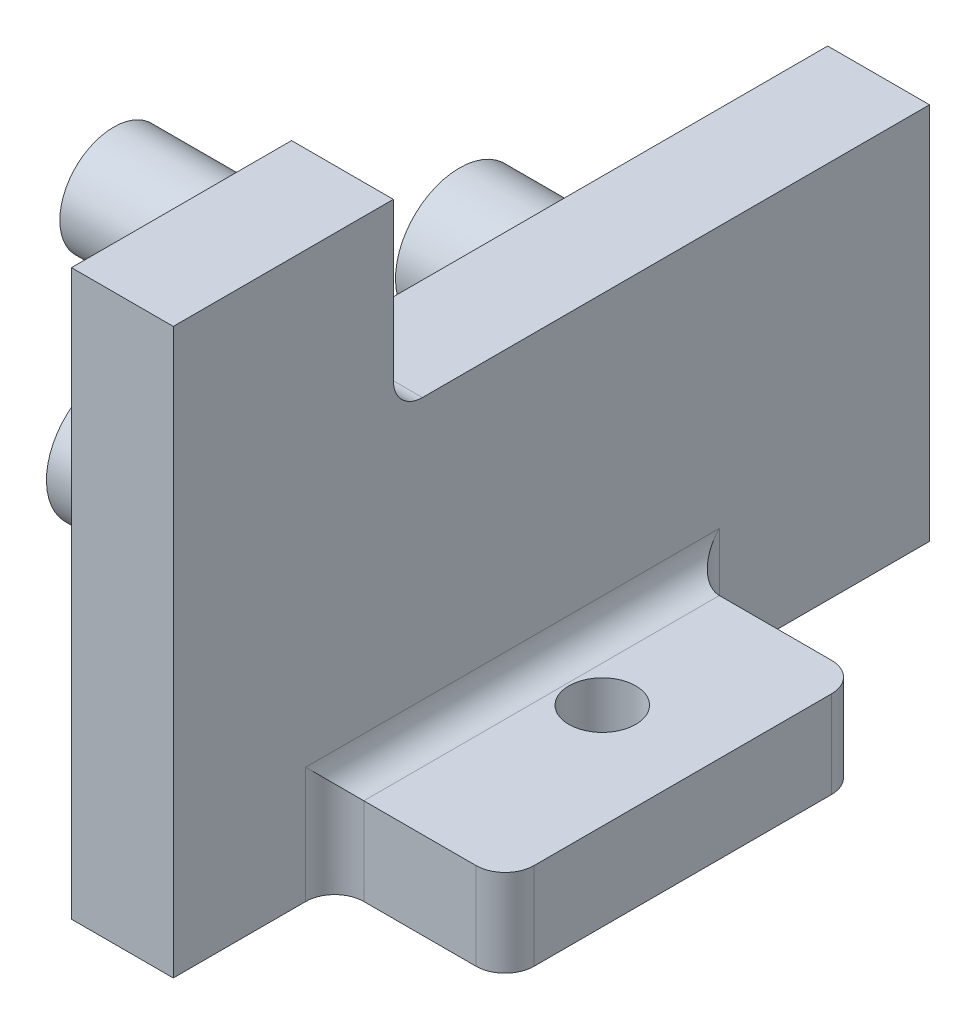
ISO-10303-21;
HEADER;
FILE_DESCRIPTION(('STEP AP214'),'2;1');
FILE_NAME('part.step','',(''),(''),'','','');
FILE_SCHEMA(('AUTOMOTIVE_DESIGN { 1 0 10303 214 1 1 1 1 }'));
ENDSEC;
DATA;
#1=APPLICATION_CONTEXT('core data for automotive mechanical design processes');
#2=APPLICATION_PROTOCOL_DEFINITION('international standard','automotive_design',2000,#1);
#3=PRODUCT_CONTEXT('',#1,'mechanical');
#4=PRODUCT('Part','Part','',(#3));
#5=PRODUCT_RELATED_PRODUCT_CATEGORY('part','',(#4));
#6=PRODUCT_DEFINITION_FORMATION('','',#4);
#7=PRODUCT_DEFINITION_CONTEXT('part definition',#1,'design');
#8=PRODUCT_DEFINITION('design','',#6,#7);
#9=PRODUCT_DEFINITION_SHAPE('','',#8);
#10=(LENGTH_UNIT() NAMED_UNIT(*) SI_UNIT(.MILLI.,.METRE.));
#11=(NAMED_UNIT(*) PLANE_ANGLE_UNIT() SI_UNIT($,.RADIAN.));
#12=(NAMED_UNIT(*) SI_UNIT($,.STERADIAN.) SOLID_ANGLE_UNIT());
#13=UNCERTAINTY_MEASURE_WITH_UNIT(LENGTH_MEASURE(1.E-05),#10,'distance_accuracy_value','');
#14=(GEOMETRIC_REPRESENTATION_CONTEXT(3) GLOBAL_UNCERTAINTY_ASSIGNED_CONTEXT((#13)) GLOBAL_UNIT_ASSIGNED_CONTEXT((#10,
#11,#12)) REPRESENTATION_CONTEXT('',''));
#15=CARTESIAN_POINT('',(0.,0.,0.));
#16=DIRECTION('',(0.,0.,1.));
#17=DIRECTION('',(1.,0.,0.));
#18=AXIS2_PLACEMENT_3D('',#15,#16,#17);
#19=CARTESIAN_POINT('',(7.22580761951249,-2.588131767118,19.447472496282));
#20=DIRECTION('',(0.,1.,0.));
#21=DIRECTION('',(0.,0.,1.));
#22=AXIS2_PLACEMENT_3D('',#19,#20,#21);
#23=CYLINDRICAL_SURFACE('',#22,1.);
#24=DIRECTION('',(0.,1.,0.));
#25=VECTOR('',#24,1.);
#26=CARTESIAN_POINT('',(7.22580761951249,-2.588131767118,20.447472496282));
#27=LINE('',#26,#25);
#28=CARTESIAN_POINT('',(7.22580761951249,-5.588131767118,20.447472496282));
#29=VERTEX_POINT('',#28);
#30=CARTESIAN_POINT('',(7.22580761951249,-2.588131767118,20.447472496282));
#31=VERTEX_POINT('',#30);
#32=EDGE_CURVE('E293',#29,#31,#27,.T.);
#33=ORIENTED_EDGE('',*,*,#32,.F.);
#34=CARTESIAN_POINT('',(7.22580761951249,-5.588131767118,19.447472496282));
#35=DIRECTION('',(0.,1.,0.));
#36=DIRECTION('',(0.,0.,1.));
#37=AXIS2_PLACEMENT_3D('',#34,#35,#36);
#38=CIRCLE('',#37,1.);
#39=CARTESIAN_POINT('',(8.22580761951249,-5.588131767118,19.447472496282));
#40=VERTEX_POINT('',#39);
#41=EDGE_CURVE('E299',#40,#29,#38,.F.);
#42=ORIENTED_EDGE('',*,*,#41,.F.);
#43=DIRECTION('',(0.,1.,0.));
#44=VECTOR('',#43,1.);
#45=CARTESIAN_POINT('',(8.22580761951249,-2.588131767118,19.447472496282));
#46=LINE('',#45,#44);
#47=CARTESIAN_POINT('',(8.22580761951249,-2.588131767118,19.447472496282));
#48=VERTEX_POINT('',#47);
#49=EDGE_CURVE('E296',#48,#40,#46,.F.);
#50=ORIENTED_EDGE('',*,*,#49,.F.);
#51=CARTESIAN_POINT('',(7.22580761951249,-2.588131767118,19.447472496282));
#52=DIRECTION('',(0.,-1.,0.));
#53=DIRECTION('',(0.,0.,-1.));
#54=AXIS2_PLACEMENT_3D('',#51,#52,#53);
#55=CIRCLE('',#54,1.);
#56=EDGE_CURVE('E301',#31,#48,#55,.F.);
#57=ORIENTED_EDGE('',*,*,#56,.F.);
#58=EDGE_LOOP('',(#33,#42,#50,#57));
#59=FACE_BOUND('',#58,.T.);
#60=ADVANCED_FACE('F42',(#59),#23,.T.);
#61=CARTESIAN_POINT('',(7.22580761951249,-2.588131767118,9.22469685295635));
#62=DIRECTION('',(0.,-1.,0.));
#63=DIRECTION('',(0.,0.,-1.));
#64=AXIS2_PLACEMENT_3D('',#61,#62,#63);
#65=CYLINDRICAL_SURFACE('',#64,1.);
#66=DIRECTION('',(0.,-1.,0.));
#67=VECTOR('',#66,1.);
#68=CARTESIAN_POINT('',(7.22580761951249,-2.588131767118,8.22469685295635));
#69=LINE('',#68,#67);
#70=CARTESIAN_POINT('',(7.22580761951249,-2.588131767118,8.22469685295635));
#71=VERTEX_POINT('',#70);
#72=CARTESIAN_POINT('',(7.22580761951249,-5.588131767118,8.22469685295635));
#73=VERTEX_POINT('',#72);
#74=EDGE_CURVE('E283',#71,#73,#69,.T.);
#75=ORIENTED_EDGE('',*,*,#74,.F.);
#76=CARTESIAN_POINT('',(7.22580761951249,-2.588131767118,9.22469685295635));
#77=DIRECTION('',(0.,-1.,0.));
#78=DIRECTION('',(0.,0.,-1.));
#79=AXIS2_PLACEMENT_3D('',#76,#77,#78);
#80=CIRCLE('',#79,1.);
#81=CARTESIAN_POINT('',(8.22580761951249,-2.588131767118,9.22469685295635));
#82=VERTEX_POINT('',#81);
#83=EDGE_CURVE('E289',#82,#71,#80,.F.);
#84=ORIENTED_EDGE('',*,*,#83,.F.);
#85=DIRECTION('',(0.,-1.,0.));
#86=VECTOR('',#85,1.);
#87=CARTESIAN_POINT('',(8.22580761951249,-2.588131767118,9.22469685295635));
#88=LINE('',#87,#86);
#89=CARTESIAN_POINT('',(8.22580761951249,-5.588131767118,9.22469685295635));
#90=VERTEX_POINT('',#89);
#91=EDGE_CURVE('E286',#90,#82,#88,.F.);
#92=ORIENTED_EDGE('',*,*,#91,.F.);
#93=CARTESIAN_POINT('',(7.22580761951249,-5.588131767118,9.22469685295635));
#94=DIRECTION('',(0.,1.,0.));
#95=DIRECTION('',(0.,0.,1.));
#96=AXIS2_PLACEMENT_3D('',#93,#94,#95);
#97=CIRCLE('',#96,1.);
#98=EDGE_CURVE('E291',#73,#90,#97,.F.);
#99=ORIENTED_EDGE('',*,*,#98,.F.);
#100=EDGE_LOOP('',(#75,#84,#92,#99));
#101=FACE_BOUND('',#100,.T.);
#102=ADVANCED_FACE('F352',(#101),#65,.T.);
#103=CARTESIAN_POINT('',(3.37133550488599,-2.588131767118,7.22469685295635));
#104=DIRECTION('',(0.,-1.,0.));
#105=DIRECTION('',(0.,0.,-1.));
#106=AXIS2_PLACEMENT_3D('',#103,#104,#105);
#107=CYLINDRICAL_SURFACE('',#106,1.);
#108=DIRECTION('',(0.,1.,0.));
#109=VECTOR('',#108,1.);
#110=CARTESIAN_POINT('',(3.37133550488599,-2.588131767118,8.22469685295635));
#111=LINE('',#110,#109);
#112=CARTESIAN_POINT('',(3.37133550488599,-5.588131767118,8.22469685295635));
#113=VERTEX_POINT('',#112);
#114=CARTESIAN_POINT('',(3.37133550488599,-2.588131767118,8.22469685295635));
#115=VERTEX_POINT('',#114);
#116=EDGE_CURVE('E273',#113,#115,#111,.T.);
#117=ORIENTED_EDGE('',*,*,#116,.F.);
#118=CARTESIAN_POINT('',(3.37133550488599,-5.588131767118,7.22469685295635));
#119=DIRECTION('',(0.,1.,0.));
#120=DIRECTION('',(0.,0.,1.));
#121=AXIS2_PLACEMENT_3D('',#118,#119,#120);
#122=CIRCLE('',#121,1.);
#123=CARTESIAN_POINT('',(2.37133550488599,-5.588131767118,7.22469685295635));
#124=VERTEX_POINT('',#123);
#125=EDGE_CURVE('E279',#113,#124,#122,.F.);
#126=ORIENTED_EDGE('',*,*,#125,.T.);
#127=DIRECTION('',(0.,1.,0.));
#128=VECTOR('',#127,1.);
#129=CARTESIAN_POINT('',(2.37133550488599,-2.588131767118,7.22469685295635));
#130=LINE('',#129,#128);
#131=CARTESIAN_POINT('',(2.37133550488599,-1.588131767118,7.22469685295635));
#132=VERTEX_POINT('',#131);
#133=EDGE_CURVE('E276',#132,#124,#130,.F.);
#134=ORIENTED_EDGE('',*,*,#133,.F.);
#135=CARTESIAN_POINT('',(3.37133550488599,-1.588131767118,7.22469685295635));
#136=DIRECTION('',(0.,-0.707106781186547,-0.707106781186547));
#137=DIRECTION('',(0.,0.707106781186547,-0.707106781186547));
#138=AXIS2_PLACEMENT_3D('',#135,#136,#137);
#139=ELLIPSE('',#138,1.41421356237309,1.);
#140=EDGE_CURVE('E281',#132,#115,#139,.F.);
#141=ORIENTED_EDGE('',*,*,#140,.T.);
#142=EDGE_LOOP('',(#117,#126,#134,#141));
#143=FACE_BOUND('',#142,.T.);
#144=ADVANCED_FACE('F357',(#143),#107,.F.);
#145=CARTESIAN_POINT('',(3.37133550488599,7.411868232882,21.447472496282));
#146=DIRECTION('',(0.,-1.,0.));
#147=DIRECTION('',(0.,0.,-1.));
#148=AXIS2_PLACEMENT_3D('',#145,#146,#147);
#149=CYLINDRICAL_SURFACE('',#148,1.);
#150=DIRECTION('',(0.,1.,0.));
#151=VECTOR('',#150,1.);
#152=CARTESIAN_POINT('',(2.37133550488599,7.411868232882,21.447472496282));
#153=LINE('',#152,#151);
#154=CARTESIAN_POINT('',(2.37133550488599,-5.588131767118,21.447472496282));
#155=VERTEX_POINT('',#154);
#156=CARTESIAN_POINT('',(2.37133550488599,-1.588131767118,21.447472496282));
#157=VERTEX_POINT('',#156);
#158=EDGE_CURVE('E261',#155,#157,#153,.T.);
#159=ORIENTED_EDGE('',*,*,#158,.F.);
#160=CARTESIAN_POINT('',(3.37133550488599,-5.588131767118,21.447472496282));
#161=DIRECTION('',(0.,1.,0.));
#162=DIRECTION('',(0.,0.,1.));
#163=AXIS2_PLACEMENT_3D('',#160,#161,#162);
#164=CIRCLE('',#163,1.);
#165=CARTESIAN_POINT('',(3.37133550488599,-5.588131767118,20.447472496282));
#166=VERTEX_POINT('',#165);
#167=EDGE_CURVE('E267',#155,#166,#164,.F.);
#168=ORIENTED_EDGE('',*,*,#167,.T.);
#169=DIRECTION('',(0.,1.,0.));
#170=VECTOR('',#169,1.);
#171=CARTESIAN_POINT('',(3.37133550488599,7.411868232882,20.447472496282));
#172=LINE('',#171,#170);
#173=CARTESIAN_POINT('',(3.37133550488599,-2.588131767118,20.447472496282));
#174=VERTEX_POINT('',#173);
#175=EDGE_CURVE('E264',#174,#166,#172,.F.);
#176=ORIENTED_EDGE('',*,*,#175,.F.);
#177=CARTESIAN_POINT('',(3.37133550488599,-1.588131767118,21.447472496282));
#178=DIRECTION('',(0.,0.707106781186547,-0.707106781186547));
#179=DIRECTION('',(0.,-0.707106781186547,-0.707106781186547));
#180=AXIS2_PLACEMENT_3D('',#177,#178,#179);
#181=ELLIPSE('',#180,1.41421356237309,1.);
#182=EDGE_CURVE('E270',#174,#157,#181,.T.);
#183=ORIENTED_EDGE('',*,*,#182,.T.);
#184=EDGE_LOOP('',(#159,#168,#176,#183));
#185=FACE_BOUND('',#184,.T.);
#186=ADVANCED_FACE('F364',(#185),#149,.F.);
#187=CARTESIAN_POINT('',(3.37133550488599,-1.588131767118,26.));
#188=DIRECTION('',(0.,0.,-1.));
#189=DIRECTION('',(-1.,0.,0.));
#190=AXIS2_PLACEMENT_3D('',#187,#188,#189);
#191=CYLINDRICAL_SURFACE('',#190,1.);
#192=DIRECTION('',(0.,0.,-1.));
#193=VECTOR('',#192,1.);
#194=CARTESIAN_POINT('',(2.37133550488599,-1.588131767118,26.));
#195=LINE('',#194,#193);
#196=EDGE_CURVE('E254',#157,#132,#195,.T.);
#197=ORIENTED_EDGE('',*,*,#196,.F.);
#198=ORIENTED_EDGE('',*,*,#182,.F.);
#199=DIRECTION('',(0.,0.,-1.));
#200=VECTOR('',#199,1.);
#201=CARTESIAN_POINT('',(3.37133550488599,-2.588131767118,0.));
#202=LINE('',#201,#200);
#203=EDGE_CURVE('E258',#115,#174,#202,.F.);
#204=ORIENTED_EDGE('',*,*,#203,.F.);
#205=ORIENTED_EDGE('',*,*,#140,.F.);
#206=EDGE_LOOP('',(#197,#198,#204,#205));
#207=FACE_BOUND('',#206,.T.);
#208=ADVANCED_FACE('F368',(#207),#191,.F.);
#209=CARTESIAN_POINT('',(-1.12866449511401,7.411868232882,26.));
#210=DIRECTION('',(0.,1.,0.));
#211=DIRECTION('',(0.,0.,1.));
#212=AXIS2_PLACEMENT_3D('',#209,#210,#211);
#213=PLANE('',#212);
#214=DIRECTION('',(0.,0.,-1.));
#215=VECTOR('',#214,1.);
#216=CARTESIAN_POINT('',(-1.12866449511401,7.411868232882,26.));
#217=LINE('',#216,#215);
#218=CARTESIAN_POINT('',(-1.12866449511401,7.411868232882,17.4336633371393));
#219=VERTEX_POINT('',#218);
#220=CARTESIAN_POINT('',(-1.12866449511401,7.411868232882,0.));
#221=VERTEX_POINT('',#220);
#222=EDGE_CURVE('E238',#219,#221,#217,.T.);
#223=ORIENTED_EDGE('',*,*,#222,.F.);
#224=DIRECTION('',(-1.,0.,0.));
#225=VECTOR('',#224,1.);
#226=CARTESIAN_POINT('',(2.37133550488599,7.411868232882,17.4336633371393));
#227=LINE('',#226,#225);
#228=CARTESIAN_POINT('',(2.37133550488599,7.411868232882,17.4336633371393));
#229=VERTEX_POINT('',#228);
#230=EDGE_CURVE('E63',#219,#229,#227,.F.);
#231=ORIENTED_EDGE('',*,*,#230,.T.);
#232=DIRECTION('',(0.,0.,-1.));
#233=VECTOR('',#232,1.);
#234=CARTESIAN_POINT('',(2.37133550488599,7.411868232882,26.));
#235=LINE('',#234,#233);
#236=CARTESIAN_POINT('',(2.37133550488599,7.411868232882,0.));
#237=VERTEX_POINT('',#236);
#238=EDGE_CURVE('E228',#229,#237,#235,.T.);
#239=ORIENTED_EDGE('',*,*,#238,.T.);
#240=DIRECTION('',(1.,0.,0.));
#241=VECTOR('',#240,1.);
#242=CARTESIAN_POINT('',(-1.12866449511401,7.411868232882,0.));
#243=LINE('',#242,#241);
#244=EDGE_CURVE('E220',#221,#237,#243,.T.);
#245=ORIENTED_EDGE('',*,*,#244,.F.);
#246=EDGE_LOOP('',(#223,#231,#239,#245));
#247=FACE_BOUND('',#246,.T.);
#248=ADVANCED_FACE('F327',(#247),#213,.T.);
#249=CARTESIAN_POINT('',(-1.12866449511401,7.411868232882,26.));
#250=DIRECTION('',(1.,0.,0.));
#251=DIRECTION('',(0.,1.,0.));
#252=AXIS2_PLACEMENT_3D('',#249,#250,#251);
#253=PLANE('',#252);
#254=CARTESIAN_POINT('',(-1.12866449511401,11.7228939153549,20.85));
#255=DIRECTION('',(1.,0.,0.));
#256=DIRECTION('',(0.,1.,0.));
#257=AXIS2_PLACEMENT_3D('',#254,#255,#256);
#258=CIRCLE('',#257,1.85);
#259=CARTESIAN_POINT('',(-1.12866449511401,13.5728939153549,20.85));
#260=VERTEX_POINT('',#259);
#261=EDGE_CURVE('E303',#260,#260,#258,.F.);
#262=ORIENTED_EDGE('',*,*,#261,.F.);
#263=EDGE_LOOP('',(#262));
#264=FACE_BOUND('',#263,.T.);
#265=CARTESIAN_POINT('',(-1.12866449511401,1.41186823288201,18.16));
#266=DIRECTION('',(1.,0.,0.));
#267=DIRECTION('',(0.,1.,0.));
#268=AXIS2_PLACEMENT_3D('',#265,#266,#267);
#269=CIRCLE('',#268,2.2);
#270=CARTESIAN_POINT('',(-1.12866449511401,3.61186823288201,18.16));
#271=VERTEX_POINT('',#270);
#272=EDGE_CURVE('E251',#271,#271,#269,.F.);
#273=ORIENTED_EDGE('',*,*,#272,.F.);
#274=EDGE_LOOP('',(#273));
#275=FACE_BOUND('',#274,.T.);
#276=CARTESIAN_POINT('',(-1.12866449511401,1.411868232882,6.16));
#277=DIRECTION('',(1.,0.,0.));
#278=DIRECTION('',(0.,1.,0.));
#279=AXIS2_PLACEMENT_3D('',#276,#277,#278);
#280=CIRCLE('',#279,2.2);
#281=CARTESIAN_POINT('',(-1.12866449511401,3.611868232882,6.16));
#282=VERTEX_POINT('',#281);
#283=EDGE_CURVE('E240',#282,#282,#280,.F.);
#284=ORIENTED_EDGE('',*,*,#283,.F.);
#285=EDGE_LOOP('',(#284));
#286=FACE_BOUND('',#285,.T.);
#287=DIRECTION('',(0.,-1.,0.));
#288=VECTOR('',#287,1.);
#289=CARTESIAN_POINT('',(-1.12866449511401,7.411868232882,0.));
#290=LINE('',#289,#288);
#291=CARTESIAN_POINT('',(-1.12866449511401,-5.588131767118,0.));
#292=VERTEX_POINT('',#291);
#293=EDGE_CURVE('E224',#221,#292,#290,.T.);
#294=ORIENTED_EDGE('',*,*,#293,.T.);
#295=DIRECTION('',(0.,0.,-1.));
#296=VECTOR('',#295,1.);
#297=CARTESIAN_POINT('',(-1.12866449511401,-5.588131767118,26.));
#298=LINE('',#297,#296);
#299=CARTESIAN_POINT('',(-1.12866449511401,-5.588131767118,26.));
#300=VERTEX_POINT('',#299);
#301=EDGE_CURVE('E241',#300,#292,#298,.T.);
#302=ORIENTED_EDGE('',*,*,#301,.F.);
#303=DIRECTION('',(0.,-1.,0.));
#304=VECTOR('',#303,1.);
#305=CARTESIAN_POINT('',(-1.12866449511401,7.411868232882,26.));
#306=LINE('',#305,#304);
#307=CARTESIAN_POINT('',(-1.12866449511401,13.8128939153549,26.));
#308=VERTEX_POINT('',#307);
#309=EDGE_CURVE('E226',#308,#300,#306,.T.);
#310=ORIENTED_EDGE('',*,*,#309,.F.);
#311=DIRECTION('',(0.,0.,-1.));
#312=VECTOR('',#311,1.);
#313=CARTESIAN_POINT('',(-1.12866449511401,13.8128939153549,26.));
#314=LINE('',#313,#312);
#315=CARTESIAN_POINT('',(-1.12866449511401,13.8128939153549,18.4336633371393));
#316=VERTEX_POINT('',#315);
#317=EDGE_CURVE('E177',#308,#316,#314,.T.);
#318=ORIENTED_EDGE('',*,*,#317,.T.);
#319=DIRECTION('',(0.,-1.,0.));
#320=VECTOR('',#319,1.);
#321=CARTESIAN_POINT('',(-1.12866449511401,7.411868232882,18.4336633371393));
#322=LINE('',#321,#320);
#323=CARTESIAN_POINT('',(-1.12866449511401,8.411868232882,18.4336633371393));
#324=VERTEX_POINT('',#323);
#325=EDGE_CURVE('E169',#316,#324,#322,.T.);
#326=ORIENTED_EDGE('',*,*,#325,.T.);
#327=CARTESIAN_POINT('',(-1.12866449511401,8.411868232882,17.4336633371393));
#328=DIRECTION('',(1.,0.,0.));
#329=DIRECTION('',(0.,1.,0.));
#330=AXIS2_PLACEMENT_3D('',#327,#328,#329);
#331=CIRCLE('',#330,1.);
#332=EDGE_CURVE('E50',#324,#219,#331,.T.);
#333=ORIENTED_EDGE('',*,*,#332,.T.);
#334=ORIENTED_EDGE('',*,*,#222,.T.);
#335=EDGE_LOOP('',(#294,#302,#310,#318,#326,#333,#334));
#336=FACE_BOUND('',#335,.T.);
#337=ADVANCED_FACE('F309',(#264,#275,#286,#336),#253,.F.);
#338=CARTESIAN_POINT('',(-1.12866449511401,-5.588131767118,26.));
#339=DIRECTION('',(0.,1.,0.));
#340=DIRECTION('',(0.,0.,1.));
#341=AXIS2_PLACEMENT_3D('',#338,#339,#340);
#342=PLANE('',#341);
#343=DIRECTION('',(0.,0.,1.));
#344=VECTOR('',#343,1.);
#345=CARTESIAN_POINT('',(8.22580761951249,-5.588131767118,20.447472496282));
#346=LINE('',#345,#344);
#347=EDGE_CURVE('E199',#90,#40,#346,.T.);
#348=ORIENTED_EDGE('',*,*,#347,.T.);
#349=ORIENTED_EDGE('',*,*,#41,.T.);
#350=DIRECTION('',(-1.,0.,0.));
#351=VECTOR('',#350,1.);
#352=CARTESIAN_POINT('',(2.37133550488599,-5.588131767118,20.447472496282));
#353=LINE('',#352,#351);
#354=EDGE_CURVE('E190',#29,#166,#353,.T.);
#355=ORIENTED_EDGE('',*,*,#354,.T.);
#356=ORIENTED_EDGE('',*,*,#167,.F.);
#357=DIRECTION('',(0.,0.,-1.));
#358=VECTOR('',#357,1.);
#359=CARTESIAN_POINT('',(2.37133550488599,-5.588131767118,26.));
#360=LINE('',#359,#358);
#361=CARTESIAN_POINT('',(2.37133550488599,-5.588131767118,26.));
#362=VERTEX_POINT('',#361);
#363=EDGE_CURVE('E244',#362,#155,#360,.T.);
#364=ORIENTED_EDGE('',*,*,#363,.F.);
#365=DIRECTION('',(1.,0.,0.));
#366=VECTOR('',#365,1.);
#367=CARTESIAN_POINT('',(-1.12866449511401,-5.588131767118,26.));
#368=LINE('',#367,#366);
#369=EDGE_CURVE('E223',#300,#362,#368,.T.);
#370=ORIENTED_EDGE('',*,*,#369,.F.);
#371=ORIENTED_EDGE('',*,*,#301,.T.);
#372=DIRECTION('',(1.,0.,0.));
#373=VECTOR('',#372,1.);
#374=CARTESIAN_POINT('',(-1.12866449511401,-5.588131767118,0.));
#375=LINE('',#374,#373);
#376=CARTESIAN_POINT('',(2.37133550488599,-5.588131767118,0.));
#377=VERTEX_POINT('',#376);
#378=EDGE_CURVE('E234',#292,#377,#375,.T.);
#379=ORIENTED_EDGE('',*,*,#378,.T.);
#380=EDGE_CURVE('E247',#124,#377,#360,.T.);
#381=ORIENTED_EDGE('',*,*,#380,.F.);
#382=ORIENTED_EDGE('',*,*,#125,.F.);
#383=DIRECTION('',(1.,0.,0.));
#384=VECTOR('',#383,1.);
#385=CARTESIAN_POINT('',(2.37133550488599,-5.588131767118,8.22469685295635));
#386=LINE('',#385,#384);
#387=EDGE_CURVE('E196',#113,#73,#386,.T.);
#388=ORIENTED_EDGE('',*,*,#387,.T.);
#389=ORIENTED_EDGE('',*,*,#98,.T.);
#390=EDGE_LOOP('',(#348,#349,#355,#356,#364,#370,#371,#379,#381,#382,#388,#389));
#391=FACE_BOUND('',#390,.T.);
#392=CARTESIAN_POINT('',(4.62133550488599,-5.588131767118,13.5));
#393=DIRECTION('',(0.,-1.,0.));
#394=DIRECTION('',(0.,0.,-1.));
#395=AXIS2_PLACEMENT_3D('',#392,#393,#394);
#396=CIRCLE('',#395,1.15);
#397=CARTESIAN_POINT('',(4.62133550488599,-5.588131767118,12.35));
#398=VERTEX_POINT('',#397);
#399=EDGE_CURVE('E182',#398,#398,#396,.T.);
#400=ORIENTED_EDGE('',*,*,#399,.F.);
#401=EDGE_LOOP('',(#400));
#402=FACE_BOUND('',#401,.T.);
#403=CARTESIAN_POINT('',(0.621335504885992,-5.588131767118,18.));
#404=DIRECTION('',(0.,-1.,0.));
#405=DIRECTION('',(0.,0.,-1.));
#406=AXIS2_PLACEMENT_3D('',#403,#404,#405);
#407=CIRCLE('',#406,0.799999999999999);
#408=CARTESIAN_POINT('',(0.621335504885992,-5.588131767118,17.2));
#409=VERTEX_POINT('',#408);
#410=EDGE_CURVE('E195',#409,#409,#407,.T.);
#411=ORIENTED_EDGE('',*,*,#410,.F.);
#412=EDGE_LOOP('',(#411));
#413=FACE_BOUND('',#412,.T.);
#414=CARTESIAN_POINT('',(0.621335504885992,-5.588131767118,9.));
#415=DIRECTION('',(0.,-1.,0.));
#416=DIRECTION('',(0.,0.,-1.));
#417=AXIS2_PLACEMENT_3D('',#414,#415,#416);
#418=CIRCLE('',#417,0.799999999999999);
#419=CARTESIAN_POINT('',(0.621335504885992,-5.588131767118,8.2));
#420=VERTEX_POINT('',#419);
#421=EDGE_CURVE('E208',#420,#420,#418,.T.);
#422=ORIENTED_EDGE('',*,*,#421,.F.);
#423=EDGE_LOOP('',(#422));
#424=FACE_BOUND('',#423,.T.);
#425=ADVANCED_FACE('F326',(#391,#402,#413,#424),#342,.F.);
#426=CARTESIAN_POINT('',(2.37133550488599,7.411868232882,26.));
#427=DIRECTION('',(1.,0.,0.));
#428=DIRECTION('',(0.,0.,-1.));
#429=AXIS2_PLACEMENT_3D('',#426,#427,#428);
#430=PLANE('',#429);
#431=ORIENTED_EDGE('',*,*,#196,.T.);
#432=ORIENTED_EDGE('',*,*,#133,.T.);
#433=ORIENTED_EDGE('',*,*,#380,.T.);
#434=DIRECTION('',(0.,-1.,0.));
#435=VECTOR('',#434,1.);
#436=CARTESIAN_POINT('',(2.37133550488599,7.411868232882,0.));
#437=LINE('',#436,#435);
#438=EDGE_CURVE('E231',#237,#377,#437,.T.);
#439=ORIENTED_EDGE('',*,*,#438,.F.);
#440=ORIENTED_EDGE('',*,*,#238,.F.);
#441=CARTESIAN_POINT('',(2.37133550488599,8.411868232882,17.4336633371393));
#442=DIRECTION('',(1.,0.,0.));
#443=DIRECTION('',(0.,0.,-1.));
#444=AXIS2_PLACEMENT_3D('',#441,#442,#443);
#445=CIRCLE('',#444,1.);
#446=CARTESIAN_POINT('',(2.37133550488599,8.411868232882,18.4336633371393));
#447=VERTEX_POINT('',#446);
#448=EDGE_CURVE('E11',#229,#447,#445,.F.);
#449=ORIENTED_EDGE('',*,*,#448,.T.);
#450=DIRECTION('',(0.,-1.,0.));
#451=VECTOR('',#450,1.);
#452=CARTESIAN_POINT('',(2.37133550488599,7.41186823288201,18.4336633371393));
#453=LINE('',#452,#451);
#454=CARTESIAN_POINT('',(2.37133550488599,13.8128939153549,18.4336633371393));
#455=VERTEX_POINT('',#454);
#456=EDGE_CURVE('E153',#455,#447,#453,.T.);
#457=ORIENTED_EDGE('',*,*,#456,.F.);
#458=DIRECTION('',(0.,0.,-1.));
#459=VECTOR('',#458,1.);
#460=CARTESIAN_POINT('',(2.37133550488599,13.8128939153549,26.));
#461=LINE('',#460,#459);
#462=CARTESIAN_POINT('',(2.37133550488599,13.8128939153549,26.));
#463=VERTEX_POINT('',#462);
#464=EDGE_CURVE('E158',#463,#455,#461,.T.);
#465=ORIENTED_EDGE('',*,*,#464,.F.);
#466=DIRECTION('',(0.,-1.,0.));
#467=VECTOR('',#466,1.);
#468=CARTESIAN_POINT('',(2.37133550488599,7.411868232882,26.));
#469=LINE('',#468,#467);
#470=EDGE_CURVE('E221',#463,#362,#469,.T.);
#471=ORIENTED_EDGE('',*,*,#470,.T.);
#472=ORIENTED_EDGE('',*,*,#363,.T.);
#473=ORIENTED_EDGE('',*,*,#158,.T.);
#474=EDGE_LOOP('',(#431,#432,#433,#439,#440,#449,#457,#465,#471,#472,#473));
#475=FACE_BOUND('',#474,.T.);
#476=ADVANCED_FACE('F155',(#475),#430,.T.);
#477=CARTESIAN_POINT('',(0.,0.,26.));
#478=DIRECTION('',(0.,0.,-1.));
#479=DIRECTION('',(-1.,0.,0.));
#480=AXIS2_PLACEMENT_3D('',#477,#478,#479);
#481=PLANE('',#480);
#482=ORIENTED_EDGE('',*,*,#470,.F.);
#483=DIRECTION('',(-1.,0.,0.));
#484=VECTOR('',#483,1.);
#485=CARTESIAN_POINT('',(12.2820660674342,13.8128939153549,26.));
#486=LINE('',#485,#484);
#487=EDGE_CURVE('E164',#463,#308,#486,.T.);
#488=ORIENTED_EDGE('',*,*,#487,.T.);
#489=ORIENTED_EDGE('',*,*,#309,.T.);
#490=ORIENTED_EDGE('',*,*,#369,.T.);
#491=EDGE_LOOP('',(#482,#488,#489,#490));
#492=FACE_BOUND('',#491,.T.);
#493=ADVANCED_FACE('F346',(#492),#481,.F.);
#494=CARTESIAN_POINT('',(0.,0.,0.));
#495=DIRECTION('',(0.,0.,-1.));
#496=DIRECTION('',(-1.,0.,0.));
#497=AXIS2_PLACEMENT_3D('',#494,#495,#496);
#498=PLANE('',#497);
#499=ORIENTED_EDGE('',*,*,#244,.T.);
#500=ORIENTED_EDGE('',*,*,#438,.T.);
#501=ORIENTED_EDGE('',*,*,#378,.F.);
#502=ORIENTED_EDGE('',*,*,#293,.F.);
#503=EDGE_LOOP('',(#499,#500,#501,#502));
#504=FACE_BOUND('',#503,.T.);
#505=ADVANCED_FACE('F336',(#504),#498,.T.);
#506=CARTESIAN_POINT('',(-7.62866449511401,1.411868232882,6.16));
#507=DIRECTION('',(1.,0.,0.));
#508=DIRECTION('',(0.,1.,0.));
#509=AXIS2_PLACEMENT_3D('',#506,#507,#508);
#510=CYLINDRICAL_SURFACE('',#509,2.2);
#511=CARTESIAN_POINT('',(-7.62866449511401,1.411868232882,6.16));
#512=DIRECTION('',(-1.,0.,0.));
#513=DIRECTION('',(0.,-1.,0.));
#514=AXIS2_PLACEMENT_3D('',#511,#512,#513);
#515=CIRCLE('',#514,2.2);
#516=CARTESIAN_POINT('',(-7.62866449511401,3.611868232882,6.16));
#517=VERTEX_POINT('',#516);
#518=EDGE_CURVE('E217',#517,#517,#515,.T.);
#519=CARTESIAN_POINT('',(-7.62866449511401,3.611868232882,6.16));
#520=CARTESIAN_POINT('',(-7.56095616178068,3.611868232882,6.16));
#521=CARTESIAN_POINT('',(-7.49324782844734,3.611868232882,6.16));
#522=CARTESIAN_POINT('',(-7.35783116178068,3.611868232882,6.16));
#523=CARTESIAN_POINT('',(-7.29012282844734,3.611868232882,6.16));
#524=CARTESIAN_POINT('',(-7.15470616178068,3.611868232882,6.16));
#525=CARTESIAN_POINT('',(-7.08699782844734,3.611868232882,6.16));
#526=CARTESIAN_POINT('',(-6.95158116178068,3.611868232882,6.16));
#527=CARTESIAN_POINT('',(-6.88387282844734,3.611868232882,6.16));
#528=CARTESIAN_POINT('',(-6.74845616178068,3.611868232882,6.16));
#529=CARTESIAN_POINT('',(-6.68074782844734,3.611868232882,6.16));
#530=CARTESIAN_POINT('',(-6.54533116178068,3.611868232882,6.16));
#531=CARTESIAN_POINT('',(-6.47762282844734,3.611868232882,6.16));
#532=CARTESIAN_POINT('',(-6.34220616178068,3.611868232882,6.16));
#533=CARTESIAN_POINT('',(-6.27449782844734,3.611868232882,6.16));
#534=CARTESIAN_POINT('',(-6.13908116178068,3.611868232882,6.16));
#535=CARTESIAN_POINT('',(-6.07137282844734,3.611868232882,6.16));
#536=CARTESIAN_POINT('',(-5.93595616178068,3.611868232882,6.16));
#537=CARTESIAN_POINT('',(-5.86824782844734,3.611868232882,6.16));
#538=CARTESIAN_POINT('',(-5.73283116178068,3.611868232882,6.16));
#539=CARTESIAN_POINT('',(-5.66512282844734,3.611868232882,6.16));
#540=CARTESIAN_POINT('',(-5.52970616178068,3.611868232882,6.16));
#541=CARTESIAN_POINT('',(-5.46199782844734,3.611868232882,6.16));
#542=CARTESIAN_POINT('',(-5.32658116178068,3.611868232882,6.16));
#543=CARTESIAN_POINT('',(-5.25887282844734,3.611868232882,6.16));
#544=CARTESIAN_POINT('',(-5.12345616178068,3.611868232882,6.16));
#545=CARTESIAN_POINT('',(-5.05574782844734,3.611868232882,6.16));
#546=CARTESIAN_POINT('',(-4.92033116178068,3.611868232882,6.16));
#547=CARTESIAN_POINT('',(-4.85262282844734,3.611868232882,6.16));
#548=CARTESIAN_POINT('',(-4.71720616178068,3.611868232882,6.16));
#549=CARTESIAN_POINT('',(-4.64949782844734,3.611868232882,6.16));
#550=CARTESIAN_POINT('',(-4.51408116178068,3.611868232882,6.16));
#551=CARTESIAN_POINT('',(-4.44637282844734,3.611868232882,6.16));
#552=CARTESIAN_POINT('',(-4.31095616178068,3.611868232882,6.16));
#553=CARTESIAN_POINT('',(-4.24324782844734,3.611868232882,6.16));
#554=CARTESIAN_POINT('',(-4.10783116178068,3.611868232882,6.16));
#555=CARTESIAN_POINT('',(-4.04012282844734,3.611868232882,6.16));
#556=CARTESIAN_POINT('',(-3.90470616178068,3.611868232882,6.16));
#557=CARTESIAN_POINT('',(-3.83699782844734,3.611868232882,6.16));
#558=CARTESIAN_POINT('',(-3.70158116178068,3.611868232882,6.16));
#559=CARTESIAN_POINT('',(-3.63387282844734,3.611868232882,6.16));
#560=CARTESIAN_POINT('',(-3.49845616178068,3.611868232882,6.16));
#561=CARTESIAN_POINT('',(-3.43074782844734,3.611868232882,6.16));
#562=CARTESIAN_POINT('',(-3.29533116178068,3.611868232882,6.16));
#563=CARTESIAN_POINT('',(-3.22762282844734,3.611868232882,6.16));
#564=CARTESIAN_POINT('',(-3.09220616178068,3.611868232882,6.16));
#565=CARTESIAN_POINT('',(-3.02449782844734,3.611868232882,6.16));
#566=CARTESIAN_POINT('',(-2.88908116178068,3.611868232882,6.16));
#567=CARTESIAN_POINT('',(-2.82137282844734,3.611868232882,6.16));
#568=CARTESIAN_POINT('',(-2.68595616178068,3.611868232882,6.16));
#569=CARTESIAN_POINT('',(-2.61824782844734,3.611868232882,6.16));
#570=CARTESIAN_POINT('',(-2.48283116178068,3.611868232882,6.16));
#571=CARTESIAN_POINT('',(-2.41512282844734,3.611868232882,6.16));
#572=CARTESIAN_POINT('',(-2.27970616178068,3.611868232882,6.16));
#573=CARTESIAN_POINT('',(-2.21199782844734,3.611868232882,6.16));
#574=CARTESIAN_POINT('',(-2.07658116178068,3.611868232882,6.16));
#575=CARTESIAN_POINT('',(-2.00887282844734,3.611868232882,6.16));
#576=CARTESIAN_POINT('',(-1.87345616178068,3.611868232882,6.16));
#577=CARTESIAN_POINT('',(-1.80574782844734,3.611868232882,6.16));
#578=CARTESIAN_POINT('',(-1.67033116178068,3.611868232882,6.16));
#579=CARTESIAN_POINT('',(-1.60262282844734,3.611868232882,6.16));
#580=CARTESIAN_POINT('',(-1.46720616178068,3.611868232882,6.16));
#581=CARTESIAN_POINT('',(-1.39949782844734,3.611868232882,6.16));
#582=CARTESIAN_POINT('',(-1.26408116178068,3.611868232882,6.16));
#583=CARTESIAN_POINT('',(-1.19637282844734,3.611868232882,6.16));
#584=CARTESIAN_POINT('',(-1.12866449511401,3.611868232882,6.16));
#585=B_SPLINE_CURVE_WITH_KNOTS('',3,(#519,#520,#521,#522,#523,#524,#525,#526,#527,#528,#529,
#530,#531,#532,#533,#534,#535,#536,#537,#538,#539,#540,#541,#542,#543,#544,#545,#546,#547,#548,
#549,#550,#551,#552,#553,#554,#555,#556,#557,#558,#559,#560,#561,#562,#563,#564,#565,#566,#567,
#568,#569,#570,#571,#572,#573,#574,#575,#576,#577,#578,#579,#580,#581,#582,#583,#584),
.UNSPECIFIED.,.F.,.F.,(4,2,2,2,2,2,2,2,2,2,2,2,2,2,2,2,2,2,2,2,2,2,2,2,2,2,2,2,2,2,2,2,4),(0.,
0.203124999999999,0.40625,0.609375,0.8125,1.015625,1.21875,1.421875,1.625,1.828125,2.03125,
2.234375,2.4375,2.640625,2.84375,3.046875,3.25,3.453125,3.65625,3.859375,4.0625,4.265625,
4.46875,4.671875,4.875,5.078125,5.28125,5.484375,5.6875,5.890625,6.09375,6.296875,6.5),.UNSPECIFIED.);
#586=EDGE_CURVE('BSEAM333',#517,#282,#585,.T.);
#587=ORIENTED_EDGE('',*,*,#518,.F.);
#588=ORIENTED_EDGE('',*,*,#283,.T.);
#589=ORIENTED_EDGE('',*,*,#586,.T.);
#590=ORIENTED_EDGE('',*,*,#586,.F.);
#591=EDGE_LOOP('',(#587,#589,#588,#590));
#592=FACE_BOUND('',#591,.T.);
#593=ADVANCED_FACE('F333',(#592),#510,.T.);
#594=CARTESIAN_POINT('',(-7.62866449511401,1.411868232882,6.16));
#595=DIRECTION('',(-1.,0.,0.));
#596=DIRECTION('',(0.,-1.,0.));
#597=AXIS2_PLACEMENT_3D('',#594,#595,#596);
#598=PLANE('',#597);
#599=ORIENTED_EDGE('',*,*,#518,.T.);
#600=EDGE_LOOP('',(#599));
#601=FACE_BOUND('',#600,.T.);
#602=ADVANCED_FACE('F335',(#601),#598,.T.);
#603=CARTESIAN_POINT('',(-7.62866449511401,1.411868232882,18.16));
#604=DIRECTION('',(1.,0.,0.));
#605=DIRECTION('',(0.,1.,0.));
#606=AXIS2_PLACEMENT_3D('',#603,#604,#605);
#607=CYLINDRICAL_SURFACE('',#606,2.2);
#608=CARTESIAN_POINT('',(-7.62866449511401,1.411868232882,18.16));
#609=DIRECTION('',(-1.,0.,0.));
#610=DIRECTION('',(0.,-1.,0.));
#611=AXIS2_PLACEMENT_3D('',#608,#609,#610);
#612=CIRCLE('',#611,2.2);
#613=CARTESIAN_POINT('',(-7.62866449511401,3.61186823288201,18.16));
#614=VERTEX_POINT('',#613);
#615=EDGE_CURVE('E214',#614,#614,#612,.T.);
#616=CARTESIAN_POINT('',(-7.62866449511401,3.61186823288201,18.16));
#617=CARTESIAN_POINT('',(-7.56095616178068,3.61186823288201,18.16));
#618=CARTESIAN_POINT('',(-7.49324782844734,3.61186823288201,18.16));
#619=CARTESIAN_POINT('',(-7.35783116178068,3.61186823288201,18.16));
#620=CARTESIAN_POINT('',(-7.29012282844734,3.61186823288201,18.16));
#621=CARTESIAN_POINT('',(-7.15470616178068,3.61186823288201,18.16));
#622=CARTESIAN_POINT('',(-7.08699782844734,3.61186823288201,18.16));
#623=CARTESIAN_POINT('',(-6.95158116178068,3.61186823288201,18.16));
#624=CARTESIAN_POINT('',(-6.88387282844734,3.61186823288201,18.16));
#625=CARTESIAN_POINT('',(-6.74845616178068,3.61186823288201,18.16));
#626=CARTESIAN_POINT('',(-6.68074782844734,3.61186823288201,18.16));
#627=CARTESIAN_POINT('',(-6.54533116178068,3.61186823288201,18.16));
#628=CARTESIAN_POINT('',(-6.47762282844734,3.61186823288201,18.16));
#629=CARTESIAN_POINT('',(-6.34220616178068,3.61186823288201,18.16));
#630=CARTESIAN_POINT('',(-6.27449782844734,3.61186823288201,18.16));
#631=CARTESIAN_POINT('',(-6.13908116178068,3.61186823288201,18.16));
#632=CARTESIAN_POINT('',(-6.07137282844734,3.61186823288201,18.16));
#633=CARTESIAN_POINT('',(-5.93595616178068,3.61186823288201,18.16));
#634=CARTESIAN_POINT('',(-5.86824782844734,3.61186823288201,18.16));
#635=CARTESIAN_POINT('',(-5.73283116178068,3.61186823288201,18.16));
#636=CARTESIAN_POINT('',(-5.66512282844734,3.61186823288201,18.16));
#637=CARTESIAN_POINT('',(-5.52970616178068,3.61186823288201,18.16));
#638=CARTESIAN_POINT('',(-5.46199782844734,3.61186823288201,18.16));
#639=CARTESIAN_POINT('',(-5.32658116178068,3.61186823288201,18.16));
#640=CARTESIAN_POINT('',(-5.25887282844734,3.61186823288201,18.16));
#641=CARTESIAN_POINT('',(-5.12345616178068,3.61186823288201,18.16));
#642=CARTESIAN_POINT('',(-5.05574782844734,3.61186823288201,18.16));
#643=CARTESIAN_POINT('',(-4.92033116178068,3.61186823288201,18.16));
#644=CARTESIAN_POINT('',(-4.85262282844734,3.61186823288201,18.16));
#645=CARTESIAN_POINT('',(-4.71720616178068,3.61186823288201,18.16));
#646=CARTESIAN_POINT('',(-4.64949782844734,3.61186823288201,18.16));
#647=CARTESIAN_POINT('',(-4.51408116178068,3.61186823288201,18.16));
#648=CARTESIAN_POINT('',(-4.44637282844734,3.61186823288201,18.16));
#649=CARTESIAN_POINT('',(-4.31095616178068,3.61186823288201,18.16));
#650=CARTESIAN_POINT('',(-4.24324782844734,3.61186823288201,18.16));
#651=CARTESIAN_POINT('',(-4.10783116178068,3.61186823288201,18.16));
#652=CARTESIAN_POINT('',(-4.04012282844734,3.61186823288201,18.16));
#653=CARTESIAN_POINT('',(-3.90470616178068,3.61186823288201,18.16));
#654=CARTESIAN_POINT('',(-3.83699782844734,3.61186823288201,18.16));
#655=CARTESIAN_POINT('',(-3.70158116178068,3.61186823288201,18.16));
#656=CARTESIAN_POINT('',(-3.63387282844734,3.61186823288201,18.16));
#657=CARTESIAN_POINT('',(-3.49845616178068,3.61186823288201,18.16));
#658=CARTESIAN_POINT('',(-3.43074782844734,3.61186823288201,18.16));
#659=CARTESIAN_POINT('',(-3.29533116178068,3.61186823288201,18.16));
#660=CARTESIAN_POINT('',(-3.22762282844734,3.61186823288201,18.16));
#661=CARTESIAN_POINT('',(-3.09220616178068,3.61186823288201,18.16));
#662=CARTESIAN_POINT('',(-3.02449782844734,3.61186823288201,18.16));
#663=CARTESIAN_POINT('',(-2.88908116178068,3.61186823288201,18.16));
#664=CARTESIAN_POINT('',(-2.82137282844734,3.61186823288201,18.16));
#665=CARTESIAN_POINT('',(-2.68595616178068,3.61186823288201,18.16));
#666=CARTESIAN_POINT('',(-2.61824782844734,3.61186823288201,18.16));
#667=CARTESIAN_POINT('',(-2.48283116178068,3.61186823288201,18.16));
#668=CARTESIAN_POINT('',(-2.41512282844734,3.61186823288201,18.16));
#669=CARTESIAN_POINT('',(-2.27970616178068,3.61186823288201,18.16));
#670=CARTESIAN_POINT('',(-2.21199782844734,3.61186823288201,18.16));
#671=CARTESIAN_POINT('',(-2.07658116178068,3.61186823288201,18.16));
#672=CARTESIAN_POINT('',(-2.00887282844734,3.61186823288201,18.16));
#673=CARTESIAN_POINT('',(-1.87345616178068,3.61186823288201,18.16));
#674=CARTESIAN_POINT('',(-1.80574782844734,3.61186823288201,18.16));
#675=CARTESIAN_POINT('',(-1.67033116178068,3.61186823288201,18.16));
#676=CARTESIAN_POINT('',(-1.60262282844734,3.61186823288201,18.16));
#677=CARTESIAN_POINT('',(-1.46720616178068,3.61186823288201,18.16));
#678=CARTESIAN_POINT('',(-1.39949782844734,3.61186823288201,18.16));
#679=CARTESIAN_POINT('',(-1.26408116178068,3.61186823288201,18.16));
#680=CARTESIAN_POINT('',(-1.19637282844734,3.61186823288201,18.16));
#681=CARTESIAN_POINT('',(-1.12866449511401,3.61186823288201,18.16));
#682=B_SPLINE_CURVE_WITH_KNOTS('',3,(#616,#617,#618,#619,#620,#621,#622,#623,#624,#625,#626,
#627,#628,#629,#630,#631,#632,#633,#634,#635,#636,#637,#638,#639,#640,#641,#642,#643,#644,#645,
#646,#647,#648,#649,#650,#651,#652,#653,#654,#655,#656,#657,#658,#659,#660,#661,#662,#663,#664,
#665,#666,#667,#668,#669,#670,#671,#672,#673,#674,#675,#676,#677,#678,#679,#680,#681),
.UNSPECIFIED.,.F.,.F.,(4,2,2,2,2,2,2,2,2,2,2,2,2,2,2,2,2,2,2,2,2,2,2,2,2,2,2,2,2,2,2,2,4),(0.,
0.203124999999999,0.40625,0.609375,0.8125,1.015625,1.21875,1.421875,1.625,1.828125,2.03125,
2.234375,2.4375,2.640625,2.84375,3.046875,3.25,3.453125,3.65625,3.859375,4.0625,4.265625,
4.46875,4.671875,4.875,5.078125,5.28125,5.484375,5.6875,5.890625,6.09375,6.296875,6.5),.UNSPECIFIED.);
#683=EDGE_CURVE('BSEAM343',#614,#271,#682,.T.);
#684=ORIENTED_EDGE('',*,*,#615,.F.);
#685=ORIENTED_EDGE('',*,*,#272,.T.);
#686=ORIENTED_EDGE('',*,*,#683,.T.);
#687=ORIENTED_EDGE('',*,*,#683,.F.);
#688=EDGE_LOOP('',(#684,#686,#685,#687));
#689=FACE_BOUND('',#688,.T.);
#690=ADVANCED_FACE('F343',(#689),#607,.T.);
#691=CARTESIAN_POINT('',(-7.62866449511401,1.411868232882,18.16));
#692=DIRECTION('',(-1.,0.,0.));
#693=DIRECTION('',(0.,-1.,0.));
#694=AXIS2_PLACEMENT_3D('',#691,#692,#693);
#695=PLANE('',#694);
#696=ORIENTED_EDGE('',*,*,#615,.T.);
#697=EDGE_LOOP('',(#696));
#698=FACE_BOUND('',#697,.T.);
#699=ADVANCED_FACE('F447',(#698),#695,.T.);
#700=CARTESIAN_POINT('',(0.621335504885992,0.411868232882005,9.));
#701=DIRECTION('',(0.,-1.,0.));
#702=DIRECTION('',(0.,0.,-1.));
#703=AXIS2_PLACEMENT_3D('',#700,#701,#702);
#704=CONICAL_SURFACE('',#703,0.799999999999999,1.02974425867665);
#705=CARTESIAN_POINT('',(0.62133550488599,0.892556728104054,9.));
#706=VERTEX_POINT('',#705);
#707=VERTEX_LOOP('',#706);
#708=FACE_BOUND('',#707,.T.);
#709=CARTESIAN_POINT('',(0.621335504885992,0.411868232882005,9.));
#710=DIRECTION('',(0.,-1.,0.));
#711=DIRECTION('',(0.,0.,-1.));
#712=AXIS2_PLACEMENT_3D('',#709,#710,#711);
#713=CIRCLE('',#712,0.799999999999999);
#714=CARTESIAN_POINT('',(0.621335504885992,0.411868232882005,8.2));
#715=VERTEX_POINT('',#714);
#716=EDGE_CURVE('E211',#715,#715,#713,.T.);
#717=ORIENTED_EDGE('',*,*,#716,.T.);
#718=EDGE_LOOP('',(#717));
#719=FACE_BOUND('',#718,.T.);
#720=ADVANCED_FACE('F443',(#708,#719),#704,.F.);
#721=CARTESIAN_POINT('',(0.621335504885992,-5.588131767118,9.));
#722=DIRECTION('',(0.,-1.,0.));
#723=DIRECTION('',(0.,0.,-1.));
#724=AXIS2_PLACEMENT_3D('',#721,#722,#723);
#725=CYLINDRICAL_SURFACE('',#724,0.799999999999999);
#726=ORIENTED_EDGE('',*,*,#716,.F.);
#727=EDGE_LOOP('',(#726));
#728=FACE_BOUND('',#727,.T.);
#729=ORIENTED_EDGE('',*,*,#421,.T.);
#730=EDGE_LOOP('',(#729));
#731=FACE_BOUND('',#730,.T.);
#732=ADVANCED_FACE('F439',(#728,#731),#725,.F.);
#733=CARTESIAN_POINT('',(0.621335504885992,0.411868232882005,18.));
#734=DIRECTION('',(0.,-1.,0.));
#735=DIRECTION('',(0.,0.,-1.));
#736=AXIS2_PLACEMENT_3D('',#733,#734,#735);
#737=CONICAL_SURFACE('',#736,0.799999999999999,1.02974425867665);
#738=CARTESIAN_POINT('',(0.62133550488599,0.892556728104054,18.));
#739=VERTEX_POINT('',#738);
#740=VERTEX_LOOP('',#739);
#741=FACE_BOUND('',#740,.T.);
#742=CARTESIAN_POINT('',(0.621335504885992,0.411868232882005,18.));
#743=DIRECTION('',(0.,-1.,0.));
#744=DIRECTION('',(0.,0.,-1.));
#745=AXIS2_PLACEMENT_3D('',#742,#743,#744);
#746=CIRCLE('',#745,0.799999999999999);
#747=CARTESIAN_POINT('',(0.621335504885992,0.411868232882005,17.2));
#748=VERTEX_POINT('',#747);
#749=EDGE_CURVE('E205',#748,#748,#746,.T.);
#750=ORIENTED_EDGE('',*,*,#749,.T.);
#751=EDGE_LOOP('',(#750));
#752=FACE_BOUND('',#751,.T.);
#753=ADVANCED_FACE('F435',(#741,#752),#737,.F.);
#754=CARTESIAN_POINT('',(0.621335504885992,-5.588131767118,18.));
#755=DIRECTION('',(0.,-1.,0.));
#756=DIRECTION('',(0.,0.,-1.));
#757=AXIS2_PLACEMENT_3D('',#754,#755,#756);
#758=CYLINDRICAL_SURFACE('',#757,0.799999999999999);
#759=ORIENTED_EDGE('',*,*,#749,.F.);
#760=EDGE_LOOP('',(#759));
#761=FACE_BOUND('',#760,.T.);
#762=ORIENTED_EDGE('',*,*,#410,.T.);
#763=EDGE_LOOP('',(#762));
#764=FACE_BOUND('',#763,.T.);
#765=ADVANCED_FACE('F425',(#761,#764),#758,.F.);
#766=CARTESIAN_POINT('',(2.37133550488599,-2.588131767118,20.447472496282));
#767=DIRECTION('',(0.,0.,1.));
#768=DIRECTION('',(1.,0.,0.));
#769=AXIS2_PLACEMENT_3D('',#766,#767,#768);
#770=PLANE('',#769);
#771=ORIENTED_EDGE('',*,*,#354,.F.);
#772=ORIENTED_EDGE('',*,*,#32,.T.);
#773=DIRECTION('',(-1.,0.,0.));
#774=VECTOR('',#773,1.);
#775=CARTESIAN_POINT('',(2.37133550488599,-2.588131767118,20.447472496282));
#776=LINE('',#775,#774);
#777=EDGE_CURVE('E193',#31,#174,#776,.T.);
#778=ORIENTED_EDGE('',*,*,#777,.T.);
#779=ORIENTED_EDGE('',*,*,#175,.T.);
#780=EDGE_LOOP('',(#771,#772,#778,#779));
#781=FACE_BOUND('',#780,.T.);
#782=ADVANCED_FACE('F421',(#781),#770,.T.);
#783=CARTESIAN_POINT('',(8.22580761951249,-2.588131767118,20.447472496282));
#784=DIRECTION('',(1.,0.,0.));
#785=DIRECTION('',(0.,0.,-1.));
#786=AXIS2_PLACEMENT_3D('',#783,#784,#785);
#787=PLANE('',#786);
#788=DIRECTION('',(0.,0.,1.));
#789=VECTOR('',#788,1.);
#790=CARTESIAN_POINT('',(8.22580761951249,-2.588131767118,20.447472496282));
#791=LINE('',#790,#789);
#792=EDGE_CURVE('E189',#82,#48,#791,.T.);
#793=ORIENTED_EDGE('',*,*,#792,.T.);
#794=ORIENTED_EDGE('',*,*,#49,.T.);
#795=ORIENTED_EDGE('',*,*,#347,.F.);
#796=ORIENTED_EDGE('',*,*,#91,.T.);
#797=EDGE_LOOP('',(#793,#794,#795,#796));
#798=FACE_BOUND('',#797,.T.);
#799=ADVANCED_FACE('F424',(#798),#787,.T.);
#800=CARTESIAN_POINT('',(2.37133550488599,-2.588131767118,8.22469685295635));
#801=DIRECTION('',(0.,0.,-1.));
#802=DIRECTION('',(-1.,0.,0.));
#803=AXIS2_PLACEMENT_3D('',#800,#801,#802);
#804=PLANE('',#803);
#805=DIRECTION('',(1.,0.,0.));
#806=VECTOR('',#805,1.);
#807=CARTESIAN_POINT('',(2.37133550488599,-2.588131767118,8.22469685295635));
#808=LINE('',#807,#806);
#809=EDGE_CURVE('E186',#115,#71,#808,.T.);
#810=ORIENTED_EDGE('',*,*,#809,.T.);
#811=ORIENTED_EDGE('',*,*,#74,.T.);
#812=ORIENTED_EDGE('',*,*,#387,.F.);
#813=ORIENTED_EDGE('',*,*,#116,.T.);
#814=EDGE_LOOP('',(#810,#811,#812,#813));
#815=FACE_BOUND('',#814,.T.);
#816=ADVANCED_FACE('F419',(#815),#804,.T.);
#817=CARTESIAN_POINT('',(0.,-2.588131767118,0.));
#818=DIRECTION('',(0.,-1.,0.));
#819=DIRECTION('',(0.,0.,-1.));
#820=AXIS2_PLACEMENT_3D('',#817,#818,#819);
#821=PLANE('',#820);
#822=CARTESIAN_POINT('',(4.62133550488599,-2.588131767118,13.5));
#823=DIRECTION('',(0.,-1.,0.));
#824=DIRECTION('',(0.,0.,-1.));
#825=AXIS2_PLACEMENT_3D('',#822,#823,#824);
#826=CIRCLE('',#825,1.15);
#827=CARTESIAN_POINT('',(4.62133550488599,-2.588131767118,12.35));
#828=VERTEX_POINT('',#827);
#829=EDGE_CURVE('E185',#828,#828,#826,.T.);
#830=ORIENTED_EDGE('',*,*,#829,.T.);
#831=EDGE_LOOP('',(#830));
#832=FACE_BOUND('',#831,.T.);
#833=ORIENTED_EDGE('',*,*,#777,.F.);
#834=ORIENTED_EDGE('',*,*,#56,.T.);
#835=ORIENTED_EDGE('',*,*,#792,.F.);
#836=ORIENTED_EDGE('',*,*,#83,.T.);
#837=ORIENTED_EDGE('',*,*,#809,.F.);
#838=ORIENTED_EDGE('',*,*,#203,.T.);
#839=EDGE_LOOP('',(#833,#834,#835,#836,#837,#838));
#840=FACE_BOUND('',#839,.T.);
#841=ADVANCED_FACE('F415',(#832,#840),#821,.F.);
#842=CARTESIAN_POINT('',(4.62133550488599,-5.588131767118,13.5));
#843=DIRECTION('',(0.,-1.,0.));
#844=DIRECTION('',(0.,0.,-1.));
#845=AXIS2_PLACEMENT_3D('',#842,#843,#844);
#846=CYLINDRICAL_SURFACE('',#845,1.15);
#847=ORIENTED_EDGE('',*,*,#399,.T.);
#848=EDGE_LOOP('',(#847));
#849=FACE_BOUND('',#848,.T.);
#850=ORIENTED_EDGE('',*,*,#829,.F.);
#851=EDGE_LOOP('',(#850));
#852=FACE_BOUND('',#851,.T.);
#853=ADVANCED_FACE('F412',(#849,#852),#846,.F.);
#854=CARTESIAN_POINT('',(12.2820660674342,13.8128939153549,26.));
#855=DIRECTION('',(0.,1.,0.));
#856=DIRECTION('',(-1.,0.,0.));
#857=AXIS2_PLACEMENT_3D('',#854,#855,#856);
#858=PLANE('',#857);
#859=ORIENTED_EDGE('',*,*,#487,.F.);
#860=ORIENTED_EDGE('',*,*,#464,.T.);
#861=DIRECTION('',(-1.,0.,0.));
#862=VECTOR('',#861,1.);
#863=CARTESIAN_POINT('',(12.2820660674342,13.8128939153549,18.4336633371393));
#864=LINE('',#863,#862);
#865=EDGE_CURVE('E165',#455,#316,#864,.T.);
#866=ORIENTED_EDGE('',*,*,#865,.T.);
#867=ORIENTED_EDGE('',*,*,#317,.F.);
#868=EDGE_LOOP('',(#859,#860,#866,#867));
#869=FACE_BOUND('',#868,.T.);
#870=ADVANCED_FACE('F174',(#869),#858,.T.);
#871=CARTESIAN_POINT('',(12.2820660674342,7.41186823288201,18.4336633371393));
#872=DIRECTION('',(0.,0.,-1.));
#873=DIRECTION('',(-1.,0.,0.));
#874=AXIS2_PLACEMENT_3D('',#871,#872,#873);
#875=PLANE('',#874);
#876=ORIENTED_EDGE('',*,*,#456,.T.);
#877=DIRECTION('',(-1.,0.,0.));
#878=VECTOR('',#877,1.);
#879=CARTESIAN_POINT('',(-1.12866449511401,8.411868232882,18.4336633371393));
#880=LINE('',#879,#878);
#881=EDGE_CURVE('E306',#447,#324,#880,.T.);
#882=ORIENTED_EDGE('',*,*,#881,.T.);
#883=ORIENTED_EDGE('',*,*,#325,.F.);
#884=ORIENTED_EDGE('',*,*,#865,.F.);
#885=EDGE_LOOP('',(#876,#882,#883,#884));
#886=FACE_BOUND('',#885,.T.);
#887=ADVANCED_FACE('F168',(#886),#875,.T.);
#888=CARTESIAN_POINT('',(-4.82866449511401,11.7228939153549,20.85));
#889=DIRECTION('',(1.,0.,0.));
#890=DIRECTION('',(0.,1.,0.));
#891=AXIS2_PLACEMENT_3D('',#888,#889,#890);
#892=CYLINDRICAL_SURFACE('',#891,1.85);
#893=CARTESIAN_POINT('',(-4.82866449511401,11.7228939153549,20.85));
#894=DIRECTION('',(-1.,0.,0.));
#895=DIRECTION('',(0.,-1.,0.));
#896=AXIS2_PLACEMENT_3D('',#893,#894,#895);
#897=CIRCLE('',#896,1.85);
#898=CARTESIAN_POINT('',(-4.82866449511401,9.87289391535487,20.85));
#899=VERTEX_POINT('',#898);
#900=EDGE_CURVE('E311',#899,#899,#897,.T.);
#901=ORIENTED_EDGE('',*,*,#900,.F.);
#902=EDGE_LOOP('',(#901));
#903=FACE_BOUND('',#902,.T.);
#904=ORIENTED_EDGE('',*,*,#261,.T.);
#905=EDGE_LOOP('',(#904));
#906=FACE_BOUND('',#905,.T.);
#907=ADVANCED_FACE('F318',(#903,#906),#892,.T.);
#908=CARTESIAN_POINT('',(-4.82866449511401,11.7228939153549,20.85));
#909=DIRECTION('',(-1.,0.,0.));
#910=DIRECTION('',(0.,-1.,0.));
#911=AXIS2_PLACEMENT_3D('',#908,#909,#910);
#912=PLANE('',#911);
#913=ORIENTED_EDGE('',*,*,#900,.T.);
#914=EDGE_LOOP('',(#913));
#915=FACE_BOUND('',#914,.T.);
#916=ADVANCED_FACE('F316',(#915),#912,.T.);
#917=CARTESIAN_POINT('',(12.2820660674342,8.411868232882,17.4336633371393));
#918=DIRECTION('',(1.,0.,0.));
#919=DIRECTION('',(0.,0.,-1.));
#920=AXIS2_PLACEMENT_3D('',#917,#918,#919);
#921=CYLINDRICAL_SURFACE('',#920,1.);
#922=ORIENTED_EDGE('',*,*,#448,.F.);
#923=ORIENTED_EDGE('',*,*,#230,.F.);
#924=ORIENTED_EDGE('',*,*,#332,.F.);
#925=ORIENTED_EDGE('',*,*,#881,.F.);
#926=EDGE_LOOP('',(#922,#923,#924,#925));
#927=FACE_BOUND('',#926,.T.);
#928=ADVANCED_FACE('F44',(#927),#921,.F.);
#929=CLOSED_SHELL('',(#60,#102,#144,#186,#208,#248,#337,#425,#476,#493,#505,#593,#602,#690,#699,
#720,#732,#753,#765,#782,#799,#816,#841,#853,#870,#887,#907,#916,#928));
#930=MANIFOLD_SOLID_BREP('B2',#929);
#931=ADVANCED_BREP_SHAPE_REPRESENTATION('',(#18,#930),#14);
#932=SHAPE_DEFINITION_REPRESENTATION(#9,#931);
ENDSEC;
END-ISO-10303-21;
